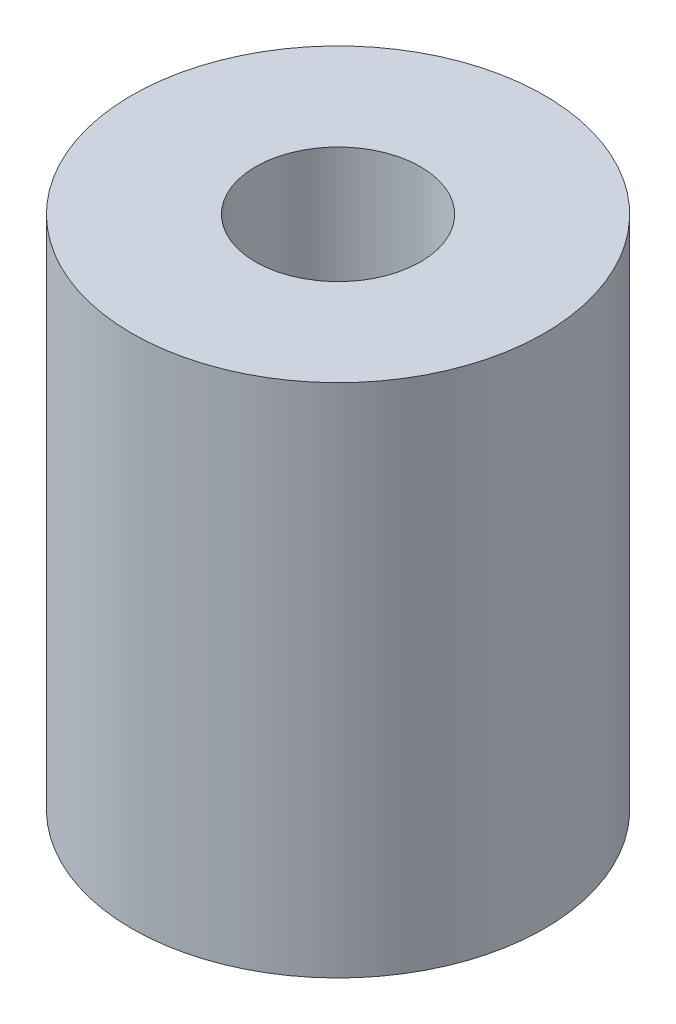
ISO-10303-21;
HEADER;
FILE_DESCRIPTION(('STEP AP214'),'2;1');
FILE_NAME('part.step','',(''),(''),'','','');
FILE_SCHEMA(('AUTOMOTIVE_DESIGN { 1 0 10303 214 1 1 1 1 }'));
ENDSEC;
DATA;
#1=APPLICATION_CONTEXT('core data for automotive mechanical design processes');
#2=APPLICATION_PROTOCOL_DEFINITION('international standard','automotive_design',2000,#1);
#3=PRODUCT_CONTEXT('',#1,'mechanical');
#4=PRODUCT('Part','Part','',(#3));
#5=PRODUCT_RELATED_PRODUCT_CATEGORY('part','',(#4));
#6=PRODUCT_DEFINITION_FORMATION('','',#4);
#7=PRODUCT_DEFINITION_CONTEXT('part definition',#1,'design');
#8=PRODUCT_DEFINITION('design','',#6,#7);
#9=PRODUCT_DEFINITION_SHAPE('','',#8);
#10=(LENGTH_UNIT() NAMED_UNIT(*) SI_UNIT(.MILLI.,.METRE.));
#11=(NAMED_UNIT(*) PLANE_ANGLE_UNIT() SI_UNIT($,.RADIAN.));
#12=(NAMED_UNIT(*) SI_UNIT($,.STERADIAN.) SOLID_ANGLE_UNIT());
#13=UNCERTAINTY_MEASURE_WITH_UNIT(LENGTH_MEASURE(1.E-05),#10,'distance_accuracy_value','');
#14=(GEOMETRIC_REPRESENTATION_CONTEXT(3) GLOBAL_UNCERTAINTY_ASSIGNED_CONTEXT((#13)) GLOBAL_UNIT_ASSIGNED_CONTEXT((#10,
#11,#12)) REPRESENTATION_CONTEXT('',''));
#15=CARTESIAN_POINT('',(0.,0.,0.));
#16=DIRECTION('',(0.,0.,1.));
#17=DIRECTION('',(1.,0.,0.));
#18=AXIS2_PLACEMENT_3D('',#15,#16,#17);
#19=CARTESIAN_POINT('',(0.,25.,0.));
#20=DIRECTION('',(0.,-1.,0.));
#21=DIRECTION('',(0.,0.,-1.));
#22=AXIS2_PLACEMENT_3D('',#19,#20,#21);
#23=CYLINDRICAL_SURFACE('',#22,10.);
#24=CARTESIAN_POINT('',(0.,25.,0.));
#25=DIRECTION('',(0.,1.,0.));
#26=DIRECTION('',(0.,0.,1.));
#27=AXIS2_PLACEMENT_3D('',#24,#25,#26);
#28=CIRCLE('',#27,10.);
#29=CARTESIAN_POINT('',(0.,25.,10.));
#30=VERTEX_POINT('',#29);
#31=EDGE_CURVE('E10',#30,#30,#28,.T.);
#32=ORIENTED_EDGE('',*,*,#31,.F.);
#33=EDGE_LOOP('',(#32));
#34=FACE_BOUND('',#33,.T.);
#35=CARTESIAN_POINT('',(0.,0.,0.));
#36=DIRECTION('',(0.,1.,0.));
#37=DIRECTION('',(0.,0.,1.));
#38=AXIS2_PLACEMENT_3D('',#35,#36,#37);
#39=CIRCLE('',#38,10.);
#40=CARTESIAN_POINT('',(0.,0.,10.));
#41=VERTEX_POINT('',#40);
#42=EDGE_CURVE('E40',#41,#41,#39,.T.);
#43=ORIENTED_EDGE('',*,*,#42,.T.);
#44=EDGE_LOOP('',(#43));
#45=FACE_BOUND('',#44,.T.);
#46=ADVANCED_FACE('F37',(#34,#45),#23,.T.);
#47=CARTESIAN_POINT('',(0.,25.,0.));
#48=DIRECTION('',(0.,1.,0.));
#49=DIRECTION('',(0.,0.,1.));
#50=AXIS2_PLACEMENT_3D('',#47,#48,#49);
#51=PLANE('',#50);
#52=CARTESIAN_POINT('',(0.,25.,0.));
#53=DIRECTION('',(0.,1.,0.));
#54=DIRECTION('',(0.,0.,1.));
#55=AXIS2_PLACEMENT_3D('',#52,#53,#54);
#56=CIRCLE('',#55,4.);
#57=CARTESIAN_POINT('',(0.,25.,4.));
#58=VERTEX_POINT('',#57);
#59=EDGE_CURVE('E49',#58,#58,#56,.T.);
#60=ORIENTED_EDGE('',*,*,#59,.F.);
#61=EDGE_LOOP('',(#60));
#62=FACE_BOUND('',#61,.T.);
#63=ORIENTED_EDGE('',*,*,#31,.T.);
#64=EDGE_LOOP('',(#63));
#65=FACE_BOUND('',#64,.T.);
#66=ADVANCED_FACE('F74',(#62,#65),#51,.T.);
#67=CARTESIAN_POINT('',(0.,0.,0.));
#68=DIRECTION('',(0.,1.,0.));
#69=DIRECTION('',(0.,0.,1.));
#70=AXIS2_PLACEMENT_3D('',#67,#68,#69);
#71=PLANE('',#70);
#72=CARTESIAN_POINT('',(0.,0.,0.));
#73=DIRECTION('',(0.,-1.,0.));
#74=DIRECTION('',(0.,0.,-1.));
#75=AXIS2_PLACEMENT_3D('',#72,#73,#74);
#76=CIRCLE('',#75,2.5);
#77=CARTESIAN_POINT('',(0.,0.,-2.5));
#78=VERTEX_POINT('',#77);
#79=EDGE_CURVE('E55',#78,#78,#76,.T.);
#80=ORIENTED_EDGE('',*,*,#79,.F.);
#81=EDGE_LOOP('',(#80));
#82=FACE_BOUND('',#81,.T.);
#83=ORIENTED_EDGE('',*,*,#42,.F.);
#84=EDGE_LOOP('',(#83));
#85=FACE_BOUND('',#84,.T.);
#86=ADVANCED_FACE('F70',(#82,#85),#71,.F.);
#87=CARTESIAN_POINT('',(0.,16.,0.));
#88=DIRECTION('',(0.,1.,0.));
#89=DIRECTION('',(0.,0.,1.));
#90=AXIS2_PLACEMENT_3D('',#87,#88,#89);
#91=CYLINDRICAL_SURFACE('',#90,4.);
#92=CARTESIAN_POINT('',(0.,16.,0.));
#93=DIRECTION('',(0.,1.,0.));
#94=DIRECTION('',(0.,0.,1.));
#95=AXIS2_PLACEMENT_3D('',#92,#93,#94);
#96=CIRCLE('',#95,4.);
#97=CARTESIAN_POINT('',(0.,16.,4.));
#98=VERTEX_POINT('',#97);
#99=EDGE_CURVE('E47',#98,#98,#96,.T.);
#100=ORIENTED_EDGE('',*,*,#99,.F.);
#101=EDGE_LOOP('',(#100));
#102=FACE_BOUND('',#101,.T.);
#103=ORIENTED_EDGE('',*,*,#59,.T.);
#104=EDGE_LOOP('',(#103));
#105=FACE_BOUND('',#104,.T.);
#106=ADVANCED_FACE('F73',(#102,#105),#91,.F.);
#107=CARTESIAN_POINT('',(0.,16.,0.));
#108=DIRECTION('',(0.,1.,0.));
#109=DIRECTION('',(0.,0.,1.));
#110=AXIS2_PLACEMENT_3D('',#107,#108,#109);
#111=PLANE('',#110);
#112=ORIENTED_EDGE('',*,*,#99,.T.);
#113=EDGE_LOOP('',(#112));
#114=FACE_BOUND('',#113,.T.);
#115=ADVANCED_FACE('F66',(#114),#111,.T.);
#116=CARTESIAN_POINT('',(0.,11.,0.));
#117=DIRECTION('',(0.,-1.,0.));
#118=DIRECTION('',(0.,0.,-1.));
#119=AXIS2_PLACEMENT_3D('',#116,#117,#118);
#120=CYLINDRICAL_SURFACE('',#119,2.5);
#121=CARTESIAN_POINT('',(0.,11.,0.));
#122=DIRECTION('',(0.,-1.,0.));
#123=DIRECTION('',(0.,0.,-1.));
#124=AXIS2_PLACEMENT_3D('',#121,#122,#123);
#125=CIRCLE('',#124,2.5);
#126=CARTESIAN_POINT('',(0.,11.,-2.5));
#127=VERTEX_POINT('',#126);
#128=EDGE_CURVE('E52',#127,#127,#125,.T.);
#129=ORIENTED_EDGE('',*,*,#128,.F.);
#130=EDGE_LOOP('',(#129));
#131=FACE_BOUND('',#130,.T.);
#132=ORIENTED_EDGE('',*,*,#79,.T.);
#133=EDGE_LOOP('',(#132));
#134=FACE_BOUND('',#133,.T.);
#135=ADVANCED_FACE('F63',(#131,#134),#120,.F.);
#136=CARTESIAN_POINT('',(0.,11.,0.));
#137=DIRECTION('',(0.,-1.,0.));
#138=DIRECTION('',(0.,0.,-1.));
#139=AXIS2_PLACEMENT_3D('',#136,#137,#138);
#140=PLANE('',#139);
#141=ORIENTED_EDGE('',*,*,#128,.T.);
#142=EDGE_LOOP('',(#141));
#143=FACE_BOUND('',#142,.T.);
#144=ADVANCED_FACE('F61',(#143),#140,.T.);
#145=CLOSED_SHELL('',(#46,#66,#86,#106,#115,#135,#144));
#146=MANIFOLD_SOLID_BREP('B2',#145);
#147=ADVANCED_BREP_SHAPE_REPRESENTATION('',(#18,#146),#14);
#148=SHAPE_DEFINITION_REPRESENTATION(#9,#147);
ENDSEC;
END-ISO-10303-21;
